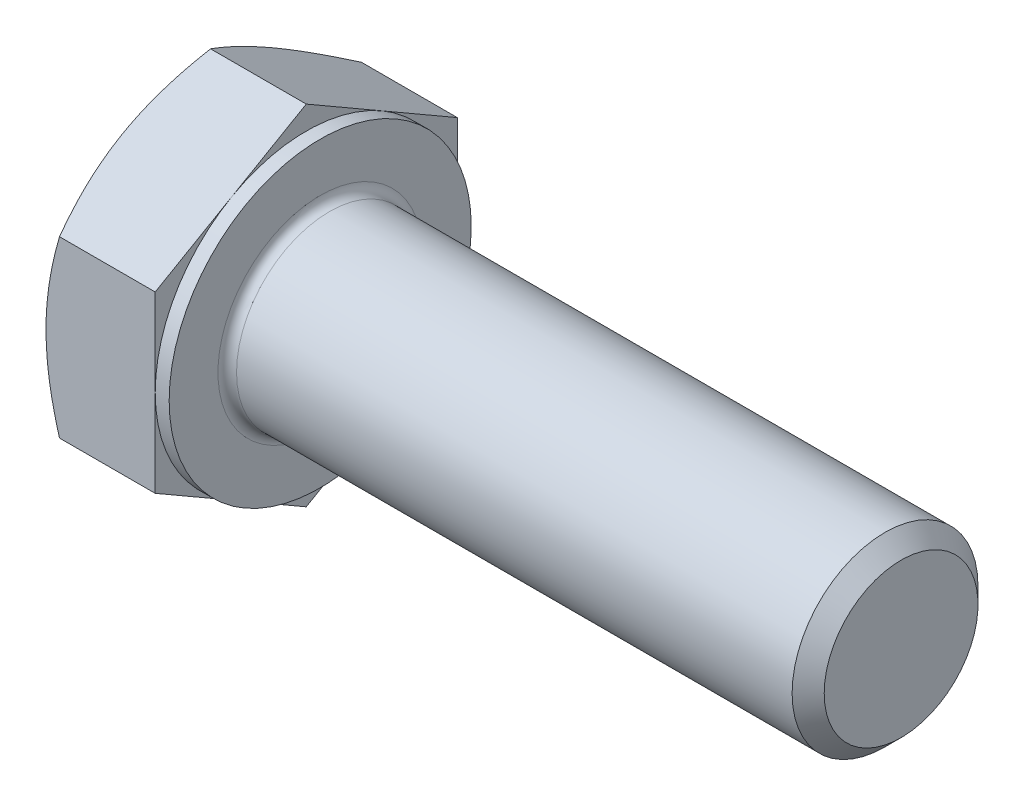
ISO-10303-21;
HEADER;
FILE_DESCRIPTION(('STEP AP214'),'2;1');
FILE_NAME('part.step','',(''),(''),'','','');
FILE_SCHEMA(('AUTOMOTIVE_DESIGN { 1 0 10303 214 1 1 1 1 }'));
ENDSEC;
DATA;
#1=APPLICATION_CONTEXT('core data for automotive mechanical design processes');
#2=APPLICATION_PROTOCOL_DEFINITION('international standard','automotive_design',2000,#1);
#3=PRODUCT_CONTEXT('',#1,'mechanical');
#4=PRODUCT('Part','Part','',(#3));
#5=PRODUCT_RELATED_PRODUCT_CATEGORY('part','',(#4));
#6=PRODUCT_DEFINITION_FORMATION('','',#4);
#7=PRODUCT_DEFINITION_CONTEXT('part definition',#1,'design');
#8=PRODUCT_DEFINITION('design','',#6,#7);
#9=PRODUCT_DEFINITION_SHAPE('','',#8);
#10=(LENGTH_UNIT() NAMED_UNIT(*) SI_UNIT(.MILLI.,.METRE.));
#11=(NAMED_UNIT(*) PLANE_ANGLE_UNIT() SI_UNIT($,.RADIAN.));
#12=(NAMED_UNIT(*) SI_UNIT($,.STERADIAN.) SOLID_ANGLE_UNIT());
#13=UNCERTAINTY_MEASURE_WITH_UNIT(LENGTH_MEASURE(1.E-05),#10,'distance_accuracy_value','');
#14=(GEOMETRIC_REPRESENTATION_CONTEXT(3) GLOBAL_UNCERTAINTY_ASSIGNED_CONTEXT((#13)) GLOBAL_UNIT_ASSIGNED_CONTEXT((#10,
#11,#12)) REPRESENTATION_CONTEXT('',''));
#15=CARTESIAN_POINT('',(0.,0.,0.));
#16=DIRECTION('',(0.,0.,1.));
#17=DIRECTION('',(1.,0.,0.));
#18=AXIS2_PLACEMENT_3D('',#15,#16,#17);
#19=CARTESIAN_POINT('',(5.3,7.50555349946514,0.));
#20=DIRECTION('',(1.,0.,0.));
#21=DIRECTION('',(0.,0.,-1.));
#22=AXIS2_PLACEMENT_3D('',#19,#20,#21);
#23=PLANE('',#22);
#24=CARTESIAN_POINT('',(5.3,0.,0.));
#25=DIRECTION('',(1.,0.,0.));
#26=DIRECTION('',(0.,0.,-1.));
#27=AXIS2_PLACEMENT_3D('',#24,#25,#26);
#28=CIRCLE('',#27,4.4);
#29=CARTESIAN_POINT('',(5.3,0.,-4.4));
#30=VERTEX_POINT('',#29);
#31=EDGE_CURVE('E44',#30,#30,#28,.F.);
#32=ORIENTED_EDGE('',*,*,#31,.T.);
#33=EDGE_LOOP('',(#32));
#34=FACE_BOUND('',#33,.T.);
#35=CARTESIAN_POINT('',(5.3,0.,0.));
#36=DIRECTION('',(1.,0.,0.));
#37=DIRECTION('',(0.,0.,-1.));
#38=AXIS2_PLACEMENT_3D('',#35,#36,#37);
#39=CIRCLE('',#38,6.5);
#40=CARTESIAN_POINT('',(5.3,0.,-6.5));
#41=VERTEX_POINT('',#40);
#42=EDGE_CURVE('E302',#41,#41,#39,.T.);
#43=ORIENTED_EDGE('',*,*,#42,.T.);
#44=EDGE_LOOP('',(#43));
#45=FACE_BOUND('',#44,.T.);
#46=ADVANCED_FACE('F36',(#34,#45),#23,.T.);
#47=CARTESIAN_POINT('',(0.,0.,0.));
#48=DIRECTION('',(-1.,0.,0.));
#49=DIRECTION('',(0.,0.,1.));
#50=AXIS2_PLACEMENT_3D('',#47,#48,#49);
#51=CYLINDRICAL_SURFACE('',#50,4.);
#52=CARTESIAN_POINT('',(5.7,0.,0.));
#53=DIRECTION('',(1.,0.,0.));
#54=DIRECTION('',(0.,0.,-1.));
#55=AXIS2_PLACEMENT_3D('',#52,#53,#54);
#56=CIRCLE('',#55,4.);
#57=CARTESIAN_POINT('',(5.7,0.,-4.));
#58=VERTEX_POINT('',#57);
#59=EDGE_CURVE('E11',#58,#58,#56,.T.);
#60=ORIENTED_EDGE('',*,*,#59,.T.);
#61=EDGE_LOOP('',(#60));
#62=FACE_BOUND('',#61,.T.);
#63=CARTESIAN_POINT('',(29.6095,0.,0.));
#64=DIRECTION('',(-1.,0.,0.));
#65=DIRECTION('',(0.,0.,1.));
#66=AXIS2_PLACEMENT_3D('',#63,#64,#65);
#67=CIRCLE('',#66,4.);
#68=CARTESIAN_POINT('',(29.6095,0.,4.));
#69=VERTEX_POINT('',#68);
#70=EDGE_CURVE('E281',#69,#69,#67,.T.);
#71=ORIENTED_EDGE('',*,*,#70,.T.);
#72=EDGE_LOOP('',(#71));
#73=FACE_BOUND('',#72,.T.);
#74=ADVANCED_FACE('F254',(#62,#73),#51,.T.);
#75=CARTESIAN_POINT('',(30.3,0.,0.));
#76=DIRECTION('',(-1.,0.,0.));
#77=DIRECTION('',(0.,0.,1.));
#78=AXIS2_PLACEMENT_3D('',#75,#76,#77);
#79=CONICAL_SURFACE('',#78,3.3095,0.785398163397441);
#80=ORIENTED_EDGE('',*,*,#70,.F.);
#81=EDGE_LOOP('',(#80));
#82=FACE_BOUND('',#81,.T.);
#83=CARTESIAN_POINT('',(30.3,0.,0.));
#84=DIRECTION('',(-1.,0.,0.));
#85=DIRECTION('',(0.,0.,1.));
#86=AXIS2_PLACEMENT_3D('',#83,#84,#85);
#87=CIRCLE('',#86,3.3095);
#88=CARTESIAN_POINT('',(30.3,0.,3.3095));
#89=VERTEX_POINT('',#88);
#90=EDGE_CURVE('E279',#89,#89,#87,.T.);
#91=ORIENTED_EDGE('',*,*,#90,.T.);
#92=EDGE_LOOP('',(#91));
#93=FACE_BOUND('',#92,.T.);
#94=ADVANCED_FACE('F260',(#82,#93),#79,.T.);
#95=CARTESIAN_POINT('',(30.3,0.,0.));
#96=DIRECTION('',(-1.,0.,0.));
#97=DIRECTION('',(0.,0.,1.));
#98=AXIS2_PLACEMENT_3D('',#95,#96,#97);
#99=PLANE('',#98);
#100=ORIENTED_EDGE('',*,*,#90,.F.);
#101=EDGE_LOOP('',(#100));
#102=FACE_BOUND('',#101,.T.);
#103=ADVANCED_FACE('F267',(#102),#99,.F.);
#104=CARTESIAN_POINT('',(4.7,6.5,0.));
#105=DIRECTION('',(1.,0.,0.));
#106=DIRECTION('',(0.,0.,-1.));
#107=AXIS2_PLACEMENT_3D('',#104,#105,#106);
#108=PLANE('',#107);
#109=DIRECTION('',(0.,0.500000000000001,0.866025403784438));
#110=VECTOR('',#109,1.);
#111=CARTESIAN_POINT('',(4.7,3.75277674973256,-6.5));
#112=LINE('',#111,#110);
#113=CARTESIAN_POINT('',(4.7,3.75277674973256,-6.5));
#114=VERTEX_POINT('',#113);
#115=CARTESIAN_POINT('',(4.7,5.62916512459885,-3.25000000000001));
#116=VERTEX_POINT('',#115);
#117=EDGE_CURVE('E168',#114,#116,#112,.T.);
#118=ORIENTED_EDGE('',*,*,#117,.T.);
#119=CARTESIAN_POINT('',(4.7,0.,0.));
#120=DIRECTION('',(-1.,0.,0.));
#121=DIRECTION('',(0.,0.,1.));
#122=AXIS2_PLACEMENT_3D('',#119,#120,#121);
#123=CIRCLE('',#122,6.5);
#124=CARTESIAN_POINT('',(4.7,0.,-6.5));
#125=VERTEX_POINT('',#124);
#126=EDGE_CURVE('E51',#116,#125,#123,.T.);
#127=ORIENTED_EDGE('',*,*,#126,.T.);
#128=DIRECTION('',(0.,1.,0.));
#129=VECTOR('',#128,1.);
#130=CARTESIAN_POINT('',(4.7,3.75277674973256,-6.5));
#131=LINE('',#130,#129);
#132=EDGE_CURVE('E305',#125,#114,#131,.T.);
#133=ORIENTED_EDGE('',*,*,#132,.T.);
#134=EDGE_LOOP('',(#118,#127,#133));
#135=FACE_BOUND('',#134,.T.);
#136=ADVANCED_FACE('F270',(#135),#108,.T.);
#137=CARTESIAN_POINT('',(4.7,7.50555349946514,0.));
#138=VERTEX_POINT('',#137);
#139=EDGE_CURVE('E166',#116,#138,#112,.T.);
#140=ORIENTED_EDGE('',*,*,#139,.T.);
#141=DIRECTION('',(0.,-0.500000000000001,0.866025403784438));
#142=VECTOR('',#141,1.);
#143=CARTESIAN_POINT('',(4.7,7.50555349946514,0.));
#144=LINE('',#143,#142);
#145=CARTESIAN_POINT('',(4.7,5.62916512459885,3.25000000000001));
#146=VERTEX_POINT('',#145);
#147=EDGE_CURVE('E165',#138,#146,#144,.T.);
#148=ORIENTED_EDGE('',*,*,#147,.T.);
#149=EDGE_CURVE('E154',#146,#116,#123,.T.);
#150=ORIENTED_EDGE('',*,*,#149,.T.);
#151=EDGE_LOOP('',(#140,#148,#150));
#152=FACE_BOUND('',#151,.T.);
#153=ADVANCED_FACE('F275',(#152),#108,.T.);
#154=CARTESIAN_POINT('',(4.7,3.75277674973256,6.5));
#155=VERTEX_POINT('',#154);
#156=EDGE_CURVE('E133',#146,#155,#144,.T.);
#157=ORIENTED_EDGE('',*,*,#156,.T.);
#158=DIRECTION('',(0.,-1.,0.));
#159=VECTOR('',#158,1.);
#160=CARTESIAN_POINT('',(4.7,3.75277674973256,6.5));
#161=LINE('',#160,#159);
#162=CARTESIAN_POINT('',(4.7,0.,6.5));
#163=VERTEX_POINT('',#162);
#164=EDGE_CURVE('E127',#155,#163,#161,.T.);
#165=ORIENTED_EDGE('',*,*,#164,.T.);
#166=EDGE_CURVE('E131',#163,#146,#123,.T.);
#167=ORIENTED_EDGE('',*,*,#166,.T.);
#168=EDGE_LOOP('',(#157,#165,#167));
#169=FACE_BOUND('',#168,.T.);
#170=ADVANCED_FACE('F129',(#169),#108,.T.);
#171=CARTESIAN_POINT('',(4.7,-3.75277674973256,6.5));
#172=VERTEX_POINT('',#171);
#173=EDGE_CURVE('E137',#163,#172,#161,.T.);
#174=ORIENTED_EDGE('',*,*,#173,.T.);
#175=DIRECTION('',(0.,-0.500000000000002,-0.866025403784437));
#176=VECTOR('',#175,1.);
#177=CARTESIAN_POINT('',(4.7,-7.50555349946515,0.));
#178=LINE('',#177,#176);
#179=CARTESIAN_POINT('',(4.7,-5.62916512459884,3.25000000000001));
#180=VERTEX_POINT('',#179);
#181=EDGE_CURVE('E144',#172,#180,#178,.T.);
#182=ORIENTED_EDGE('',*,*,#181,.T.);
#183=EDGE_CURVE('E141',#180,#163,#123,.T.);
#184=ORIENTED_EDGE('',*,*,#183,.T.);
#185=EDGE_LOOP('',(#174,#182,#184));
#186=FACE_BOUND('',#185,.T.);
#187=ADVANCED_FACE('F142',(#186),#108,.T.);
#188=CARTESIAN_POINT('',(4.7,-7.50555349946515,0.));
#189=VERTEX_POINT('',#188);
#190=EDGE_CURVE('E160',#180,#189,#178,.T.);
#191=ORIENTED_EDGE('',*,*,#190,.T.);
#192=DIRECTION('',(0.,0.500000000000001,-0.866025403784438));
#193=VECTOR('',#192,1.);
#194=CARTESIAN_POINT('',(4.7,-3.75277674973258,-6.5));
#195=LINE('',#194,#193);
#196=CARTESIAN_POINT('',(4.7,-5.62916512459885,-3.25000000000001));
#197=VERTEX_POINT('',#196);
#198=EDGE_CURVE('E343',#189,#197,#195,.T.);
#199=ORIENTED_EDGE('',*,*,#198,.T.);
#200=EDGE_CURVE('E148',#197,#180,#123,.T.);
#201=ORIENTED_EDGE('',*,*,#200,.T.);
#202=EDGE_LOOP('',(#191,#199,#201));
#203=FACE_BOUND('',#202,.T.);
#204=ADVANCED_FACE('F344',(#203),#108,.T.);
#205=CARTESIAN_POINT('',(4.7,-3.75277674973258,-6.5));
#206=VERTEX_POINT('',#205);
#207=EDGE_CURVE('E155',#197,#206,#195,.T.);
#208=ORIENTED_EDGE('',*,*,#207,.T.);
#209=EDGE_CURVE('E306',#206,#125,#131,.T.);
#210=ORIENTED_EDGE('',*,*,#209,.T.);
#211=EDGE_CURVE('E313',#125,#197,#123,.T.);
#212=ORIENTED_EDGE('',*,*,#211,.T.);
#213=EDGE_LOOP('',(#208,#210,#212));
#214=FACE_BOUND('',#213,.T.);
#215=ADVANCED_FACE('F276',(#214),#108,.T.);
#216=CARTESIAN_POINT('',(0.,0.,0.));
#217=DIRECTION('',(-1.,0.,0.));
#218=DIRECTION('',(0.,0.,1.));
#219=AXIS2_PLACEMENT_3D('',#216,#217,#218);
#220=CYLINDRICAL_SURFACE('',#219,6.5);
#221=ORIENTED_EDGE('',*,*,#126,.F.);
#222=ORIENTED_EDGE('',*,*,#149,.F.);
#223=ORIENTED_EDGE('',*,*,#166,.F.);
#224=ORIENTED_EDGE('',*,*,#183,.F.);
#225=ORIENTED_EDGE('',*,*,#200,.F.);
#226=ORIENTED_EDGE('',*,*,#211,.F.);
#227=EDGE_LOOP('',(#221,#222,#223,#224,#225,#226));
#228=FACE_BOUND('',#227,.T.);
#229=ORIENTED_EDGE('',*,*,#42,.F.);
#230=EDGE_LOOP('',(#229));
#231=FACE_BOUND('',#230,.T.);
#232=ADVANCED_FACE('F151',(#228,#231),#220,.T.);
#233=CARTESIAN_POINT('',(0.,7.50555349946514,0.));
#234=DIRECTION('',(1.,0.,0.));
#235=DIRECTION('',(0.,0.,-1.));
#236=AXIS2_PLACEMENT_3D('',#233,#234,#235);
#237=PLANE('',#236);
#238=CARTESIAN_POINT('',(0.,0.,0.));
#239=DIRECTION('',(1.,0.,0.));
#240=DIRECTION('',(0.,0.,-1.));
#241=AXIS2_PLACEMENT_3D('',#238,#239,#240);
#242=CIRCLE('',#241,6.5);
#243=CARTESIAN_POINT('',(0.,0.,-6.5));
#244=VERTEX_POINT('',#243);
#245=CARTESIAN_POINT('',(0.,5.62916512459885,-3.25000000000001));
#246=VERTEX_POINT('',#245);
#247=EDGE_CURVE('E301',#244,#246,#242,.T.);
#248=ORIENTED_EDGE('',*,*,#247,.F.);
#249=CARTESIAN_POINT('',(0.,-5.62916512459885,-3.25));
#250=VERTEX_POINT('',#249);
#251=EDGE_CURVE('E297',#250,#244,#242,.T.);
#252=ORIENTED_EDGE('',*,*,#251,.F.);
#253=CARTESIAN_POINT('',(0.,-5.62916512459884,3.25000000000001));
#254=VERTEX_POINT('',#253);
#255=EDGE_CURVE('E300',#254,#250,#242,.T.);
#256=ORIENTED_EDGE('',*,*,#255,.F.);
#257=CARTESIAN_POINT('',(0.,0.,6.5));
#258=VERTEX_POINT('',#257);
#259=EDGE_CURVE('E336',#258,#254,#242,.T.);
#260=ORIENTED_EDGE('',*,*,#259,.F.);
#261=CARTESIAN_POINT('',(0.,0.,0.));
#262=DIRECTION('',(-1.,0.,0.));
#263=DIRECTION('',(0.,0.,1.));
#264=AXIS2_PLACEMENT_3D('',#261,#262,#263);
#265=CIRCLE('',#264,6.5);
#266=CARTESIAN_POINT('',(0.,5.62916512459885,3.25000000000001));
#267=VERTEX_POINT('',#266);
#268=EDGE_CURVE('E169',#258,#267,#265,.T.);
#269=ORIENTED_EDGE('',*,*,#268,.T.);
#270=EDGE_CURVE('E359',#246,#267,#242,.T.);
#271=ORIENTED_EDGE('',*,*,#270,.F.);
#272=EDGE_LOOP('',(#248,#252,#256,#260,#269,#271));
#273=FACE_BOUND('',#272,.T.);
#274=ADVANCED_FACE('F200',(#273),#237,.F.);
#275=CARTESIAN_POINT('',(0.,0.,0.));
#276=DIRECTION('',(1.,0.,0.));
#277=DIRECTION('',(0.,0.,-1.));
#278=AXIS2_PLACEMENT_3D('',#275,#276,#277);
#279=CONICAL_SURFACE('',#278,6.5,1.0471975511966);
#280=CARTESIAN_POINT('',(0.580623251805866,3.75266127967873,6.5002));
#281=CARTESIAN_POINT('',(0.533004423075484,3.8351516191275,6.35732254094112));
#282=CARTESIAN_POINT('',(0.487546700602705,3.91794952254312,6.21391236546509));
#283=CARTESIAN_POINT('',(0.401548682023045,4.08421773795794,5.92592736868281));
#284=CARTESIAN_POINT('',(0.361010507228024,4.16768832359105,5.78135207342874));
#285=CARTESIAN_POINT('',(0.247571001123208,4.41943655294051,5.34531134947997));
#286=CARTESIAN_POINT('',(0.183047807128738,4.58870793403689,5.05212471715368));
#287=CARTESIAN_POINT('',(0.107386583547491,4.84201947708215,4.61337625445563));
#288=CARTESIAN_POINT('',(0.0858328564569873,4.92530276780316,4.46912536350531));
#289=CARTESIAN_POINT('',(0.049690314606119,5.09224566542477,4.17997178286191));
#290=CARTESIAN_POINT('',(0.0351008844596665,5.17590523841627,4.03506915190111));
#291=CARTESIAN_POINT('',(0.0132587525073469,5.34336968579964,3.74501222057168));
#292=CARTESIAN_POINT('',(0.00599772432210823,5.427174286676,3.59985839394579));
#293=CARTESIAN_POINT('',(-0.00103969741776798,5.59485627940483,3.30942466302505));
#294=CARTESIAN_POINT('',(-0.00081632218779477,5.6787336689286,3.16414476276365));
#295=CARTESIAN_POINT('',(0.0100834585151658,5.90853103021317,2.76612405757351));
#296=CARTESIAN_POINT('',(0.028381817869414,6.05437578112763,2.51351353897243));
#297=CARTESIAN_POINT('',(0.0864063414576757,6.34509659313135,2.00997032176432));
#298=CARTESIAN_POINT('',(0.126152338538245,6.48997163178545,1.75903939406692));
#299=CARTESIAN_POINT('',(0.22550590320215,6.78127752911039,1.25448277935568));
#300=CARTESIAN_POINT('',(0.285534425638028,6.92767163007068,1.00092075856409));
#301=CARTESIAN_POINT('',(0.42177499250987,7.21827667013277,0.497578064240955));
#302=CARTESIAN_POINT('',(0.497955034163595,7.36249133098589,0.247790944447036));
#303=CARTESIAN_POINT('',(0.580623251805869,7.50566896951898,-0.000200000000000043));
#304=B_SPLINE_CURVE_WITH_KNOTS('',3,(#280,#281,#282,#283,#284,#285,#286,#287,#288,#289,#290,
#291,#292,#293,#294,#295,#296,#297,#298,#299,#300,#301,#302,#303),.UNSPECIFIED.,.F.,.F.,(4,2,2,
2,2,2,2,2,2,2,2,4),(0.,0.515105052395588,1.03043143507524,2.06322554824262,2.56697389547996,
3.07067772176453,3.57380860368927,4.0769239424252,4.9527935470566,5.82947446853466,
6.72559912449737,7.61996451221046),.UNSPECIFIED.);
#305=CARTESIAN_POINT('',(0.580556583600765,7.50555349946514,0.));
#306=VERTEX_POINT('',#305);
#307=EDGE_CURVE('E220',#267,#306,#304,.T.);
#308=ORIENTED_EDGE('',*,*,#307,.T.);
#309=CARTESIAN_POINT('',(0.580623251805869,7.50566896951898,0.000200000000000058));
#310=CARTESIAN_POINT('',(0.533004423075487,7.4231786300702,-0.14267745905888));
#311=CARTESIAN_POINT('',(0.487546700602708,7.34038072665458,-0.286087634534913));
#312=CARTESIAN_POINT('',(0.401548682023048,7.17411251123976,-0.574072631317195));
#313=CARTESIAN_POINT('',(0.361010507228027,7.09064192560665,-0.718647926571264));
#314=CARTESIAN_POINT('',(0.24757100112321,6.83889369625719,-1.15468865052003));
#315=CARTESIAN_POINT('',(0.18304780712874,6.66962231516081,-1.44787528284632));
#316=CARTESIAN_POINT('',(0.107386583547492,6.41631077211555,-1.88662374554437));
#317=CARTESIAN_POINT('',(0.0858328564569873,6.33302748139454,-2.03087463649469));
#318=CARTESIAN_POINT('',(0.0496903146061189,6.16608458377293,-2.32002821713809));
#319=CARTESIAN_POINT('',(0.0351008844596667,6.08242501078143,-2.46493084809889));
#320=CARTESIAN_POINT('',(0.0132587525073468,5.91496056339806,-2.75498777942832));
#321=CARTESIAN_POINT('',(0.00599772432210739,5.8311559625217,-2.90014160605421));
#322=CARTESIAN_POINT('',(-0.00103969741776939,5.66347396979287,-3.19057533697495));
#323=CARTESIAN_POINT('',(-0.000816322187796096,5.5795965802691,-3.33585523723636));
#324=CARTESIAN_POINT('',(0.0100834585151643,5.34979921898453,-3.73387594242649));
#325=CARTESIAN_POINT('',(0.028381817869412,5.20395446807007,-3.98648646102757));
#326=CARTESIAN_POINT('',(0.0864063414576732,4.91323365606635,-4.49002967823568));
#327=CARTESIAN_POINT('',(0.126152338538243,4.76835861741225,-4.74096060593308));
#328=CARTESIAN_POINT('',(0.225505903202147,4.47705272008731,-5.24551722064432));
#329=CARTESIAN_POINT('',(0.285534425638024,4.33065861912702,-5.49907924143591));
#330=CARTESIAN_POINT('',(0.421774992509865,4.04005357906493,-6.00242193575904));
#331=CARTESIAN_POINT('',(0.497955034163589,3.89583891821181,-6.25220905555296));
#332=CARTESIAN_POINT('',(0.580623251805864,3.75266127967872,-6.5002));
#333=B_SPLINE_CURVE_WITH_KNOTS('',3,(#309,#310,#311,#312,#313,#314,#315,#316,#317,#318,#319,
#320,#321,#322,#323,#324,#325,#326,#327,#328,#329,#330,#331,#332),.UNSPECIFIED.,.F.,.F.,(4,2,2,
2,2,2,2,2,2,2,2,4),(0.,0.515105052395587,1.03043143507525,2.06322554824262,2.56697389547996,
3.07067772176454,3.57380860368928,4.0769239424252,4.9527935470566,5.82947446853466,
6.72559912449737,7.61996451221046),.UNSPECIFIED.);
#334=EDGE_CURVE('E59',#306,#246,#333,.T.);
#335=ORIENTED_EDGE('',*,*,#334,.T.);
#336=ORIENTED_EDGE('',*,*,#270,.T.);
#337=EDGE_LOOP('',(#308,#335,#336));
#338=FACE_BOUND('',#337,.T.);
#339=ADVANCED_FACE('F360',(#338),#279,.T.);
#340=CARTESIAN_POINT('',(3.18835311563218,-10.1137456673369,6.5));
#341=CARTESIAN_POINT('',(3.05034773984571,-9.82952666268362,6.5));
#342=CARTESIAN_POINT('',(2.91365616465171,-9.5446586959737,6.5));
#343=CARTESIAN_POINT('',(2.64363899475029,-8.97327978009769,6.5));
#344=CARTESIAN_POINT('',(2.51031392437708,-8.68676858342198,6.5));
#345=CARTESIAN_POINT('',(2.2471047346358,-8.11029837800201,6.5));
#346=CARTESIAN_POINT('',(2.11724300420667,-7.82032911160931,6.5));
#347=CARTESIAN_POINT('',(1.86279082811121,-7.23809540985588,6.5));
#348=CARTESIAN_POINT('',(1.73820013539998,-6.94583108282377,6.5));
#349=CARTESIAN_POINT('',(1.49176685414526,-6.3490644093219,6.5));
#350=CARTESIAN_POINT('',(1.37014257629962,-6.04447142260091,6.5));
#351=CARTESIAN_POINT('',(1.13601865749049,-5.43173420932696,6.5));
#352=CARTESIAN_POINT('',(1.02352003549992,-5.12358959057325,6.5));
#353=CARTESIAN_POINT('',(0.810575368180001,-4.50382569763974,6.5));
#354=CARTESIAN_POINT('',(0.710105232251764,-4.19221478250844,6.5));
#355=CARTESIAN_POINT('',(0.524420166111966,-3.56452019194196,6.5));
#356=CARTESIAN_POINT('',(0.439200468182008,-3.248437947833,6.5));
#357=CARTESIAN_POINT('',(0.288524223393068,-2.61335465708693,6.5));
#358=CARTESIAN_POINT('',(0.222961865744181,-2.29437912058766,6.5));
#359=CARTESIAN_POINT('',(0.115312883140193,-1.65238219411907,6.5));
#360=CARTESIAN_POINT('',(0.0732239014810091,-1.32936121363906,6.5));
#361=CARTESIAN_POINT('',(0.0304887136492794,-0.845231171985975,6.5));
#362=CARTESIAN_POINT('',(0.0196493434374821,-0.684982209825922,6.5));
#363=CARTESIAN_POINT('',(0.00475298486802876,-0.364162349261904,6.5));
#364=CARTESIAN_POINT('',(0.000695882912927172,-0.203591456295117,6.5));
#365=CARTESIAN_POINT('',(-0.000531597192431328,0.1175774301276,6.5));
#366=CARTESIAN_POINT('',(0.00229809016385267,0.278175423826781,6.5));
#367=CARTESIAN_POINT('',(0.0147726845392773,0.599108972527034,6.5));
#368=CARTESIAN_POINT('',(0.0244179260292906,0.759444514261301,6.5));
#369=CARTESIAN_POINT('',(0.0554961939005615,1.14369946568681,6.5));
#370=CARTESIAN_POINT('',(0.0801030490102269,1.36736763010324,6.5));
#371=CARTESIAN_POINT('',(0.141246537396777,1.81305591275147,6.5));
#372=CARTESIAN_POINT('',(0.177784759549961,2.03507580745699,6.5));
#373=CARTESIAN_POINT('',(0.303360001243785,2.69839633393827,6.5));
#374=CARTESIAN_POINT('',(0.408335815043155,3.13672010332747,6.5));
#375=CARTESIAN_POINT('',(0.590564593006713,3.79232112874052,6.5));
#376=CARTESIAN_POINT('',(0.65631319884288,4.01299150829171,6.5));
#377=CARTESIAN_POINT('',(0.794681634048787,4.45218858961827,6.5));
#378=CARTESIAN_POINT('',(0.867301512962924,4.67071527592428,6.5));
#379=CARTESIAN_POINT('',(1.01824353836803,5.10569490203688,6.5));
#380=CARTESIAN_POINT('',(1.09656388214599,5.32214847315217,6.5));
#381=CARTESIAN_POINT('',(1.25798086145111,5.75325725721539,6.5));
#382=CARTESIAN_POINT('',(1.34107741015562,5.96791250277235,6.5));
#383=CARTESIAN_POINT('',(1.56029019561415,6.51888445883542,6.5));
#384=CARTESIAN_POINT('',(1.69936356644503,6.85402316761088,6.5));
#385=CARTESIAN_POINT('',(1.98501958064622,7.52109583887401,6.5));
#386=CARTESIAN_POINT('',(2.13160288757765,7.85302951508196,6.5));
#387=CARTESIAN_POINT('',(2.43059748021416,8.51437865467404,6.5));
#388=CARTESIAN_POINT('',(2.5830105757321,8.84379329733069,6.5));
#389=CARTESIAN_POINT('',(2.89234869350808,9.50047798633191,6.5));
#390=CARTESIAN_POINT('',(3.04927357195785,9.82774810062368,6.5));
#391=CARTESIAN_POINT('',(3.36692013106101,10.4809971970749,6.5));
#392=CARTESIAN_POINT('',(3.52764676467091,10.8069737662429,6.5));
#393=CARTESIAN_POINT('',(3.85198555530079,11.4574882896092,6.5));
#394=CARTESIAN_POINT('',(4.01559773098172,11.7820262344869,6.5));
#395=CARTESIAN_POINT('',(4.50986184978697,12.753746810957,6.5));
#396=CARTESIAN_POINT('',(4.84399997953393,13.399155592763,6.5));
#397=CARTESIAN_POINT('',(5.48575990240557,14.6239779286089,6.5));
#398=CARTESIAN_POINT('',(5.79279643346765,15.20369957558,6.5));
#399=CARTESIAN_POINT('',(6.41069188201846,16.361138263307,6.5));
#400=CARTESIAN_POINT('',(6.72155098984205,16.9388552023925,6.5));
#401=CARTESIAN_POINT('',(7.34519775412869,18.0910273551188,6.5));
#402=CARTESIAN_POINT('',(7.65797694142596,18.6654871601313,6.5));
#403=CARTESIAN_POINT('',(8.28574397126581,19.8131486199609,6.5));
#404=CARTESIAN_POINT('',(8.60073166267673,20.386350357412,6.5));
#405=CARTESIAN_POINT('',(8.91652967142033,20.9591024516605,6.5));
#406=B_SPLINE_CURVE_WITH_KNOTS('',3,(#340,#341,#342,#343,#344,#345,#346,#347,#348,#349,#350,
#351,#352,#353,#354,#355,#356,#357,#358,#359,#360,#361,#362,#363,#364,#365,#366,#367,#368,#369,
#370,#371,#372,#373,#374,#375,#376,#377,#378,#379,#380,#381,#382,#383,#384,#385,#386,#387,#388,
#389,#390,#391,#392,#393,#394,#395,#396,#397,#398,#399,#400,#401,#402,#403,#404,#405),
.UNSPECIFIED.,.F.,.F.,(4,2,2,2,2,2,2,2,2,2,2,2,2,2,2,2,2,2,2,2,2,2,2,2,2,2,2,2,2,2,2,2,4),(0.,
0.947868666637001,1.89588406470429,2.84900320910869,3.80207763278045,4.78589774049431,
5.7698275510146,6.75175256199404,7.7333700571013,8.70960474826445,9.68574140876309,
10.1674651045585,10.6491807317952,11.1309009410869,11.612644792267,12.2873175714037,
12.9620802320305,14.3123184370259,15.0030310333297,15.6937486103038,16.3842486961975,
17.074736234034,18.1631508671877,19.2516618366358,20.3405135130782,21.4293305219253,
22.5196540535909,23.6099846390268,25.7902468223404,27.7582608860787,29.7263733417655,
31.6886408583916,33.6507753794603),.UNSPECIFIED.);
#407=CARTESIAN_POINT('',(0.580556583600762,3.75277674973256,6.5));
#408=VERTEX_POINT('',#407);
#409=EDGE_CURVE('E234',#258,#408,#406,.T.);
#410=ORIENTED_EDGE('',*,*,#409,.T.);
#411=EDGE_CURVE('E233',#408,#267,#304,.T.);
#412=ORIENTED_EDGE('',*,*,#411,.T.);
#413=ORIENTED_EDGE('',*,*,#268,.F.);
#414=EDGE_LOOP('',(#410,#412,#413));
#415=FACE_BOUND('',#414,.T.);
#416=ADVANCED_FACE('F330',(#415),#279,.T.);
#417=CARTESIAN_POINT('',(0.580556583600761,-3.75277674973256,6.5));
#418=VERTEX_POINT('',#417);
#419=EDGE_CURVE('E282',#418,#258,#406,.T.);
#420=ORIENTED_EDGE('',*,*,#419,.T.);
#421=ORIENTED_EDGE('',*,*,#259,.T.);
#422=CARTESIAN_POINT('',(0.580623251805876,-7.50566896951899,-0.000200000000000038));
#423=CARTESIAN_POINT('',(0.533004423075494,-7.42317863007021,0.142677459058881));
#424=CARTESIAN_POINT('',(0.487546700602714,-7.34038072665459,0.286087634534913));
#425=CARTESIAN_POINT('',(0.401548682023053,-7.17411251123977,0.574072631317195));
#426=CARTESIAN_POINT('',(0.361010507228032,-7.09064192560666,0.718647926571264));
#427=CARTESIAN_POINT('',(0.247571001123215,-6.8388936962572,1.15468865052003));
#428=CARTESIAN_POINT('',(0.183047807128745,-6.66962231516082,1.44787528284632));
#429=CARTESIAN_POINT('',(0.107386583547496,-6.41631077211556,1.88662374554438));
#430=CARTESIAN_POINT('',(0.0858328564569921,-6.33302748139455,2.03087463649469));
#431=CARTESIAN_POINT('',(0.0496903146061233,-6.16608458377294,2.32002821713809));
#432=CARTESIAN_POINT('',(0.0351008844596709,-6.08242501078144,2.46493084809889));
#433=CARTESIAN_POINT('',(0.0132587525073508,-5.91496056339807,2.75498777942832));
#434=CARTESIAN_POINT('',(0.00599772432211139,-5.83115596252171,2.90014160605421));
#435=CARTESIAN_POINT('',(-0.00103969741776562,-5.66347396979287,3.19057533697495));
#436=CARTESIAN_POINT('',(-0.000816322187792552,-5.5795965802691,3.33585523723636));
#437=CARTESIAN_POINT('',(0.0100834585151674,-5.34979921898453,3.7338759424265));
#438=CARTESIAN_POINT('',(0.0283818178694149,-5.20395446807007,3.98648646102757));
#439=CARTESIAN_POINT('',(0.0864063414576758,-4.91323365606636,4.49002967823568));
#440=CARTESIAN_POINT('',(0.126152338538245,-4.76835861741226,4.74096060593308));
#441=CARTESIAN_POINT('',(0.225505903202149,-4.47705272008732,5.24551722064432));
#442=CARTESIAN_POINT('',(0.285534425638026,-4.33065861912702,5.49907924143591));
#443=CARTESIAN_POINT('',(0.421774992509868,-4.04005357906493,6.00242193575904));
#444=CARTESIAN_POINT('',(0.497955034163592,-3.89583891821181,6.25220905555296));
#445=CARTESIAN_POINT('',(0.580623251805865,-3.75266127967872,6.5002));
#446=B_SPLINE_CURVE_WITH_KNOTS('',3,(#422,#423,#424,#425,#426,#427,#428,#429,#430,#431,#432,
#433,#434,#435,#436,#437,#438,#439,#440,#441,#442,#443,#444,#445),.UNSPECIFIED.,.F.,.F.,(4,2,2,
2,2,2,2,2,2,2,2,4),(0.,0.515105052395589,1.03043143507525,2.06322554824263,2.56697389547997,
3.07067772176454,3.57380860368929,4.07692394242521,4.95279354705661,5.82947446853467,
6.72559912449737,7.61996451221047),.UNSPECIFIED.);
#447=EDGE_CURVE('E222',#254,#418,#446,.T.);
#448=ORIENTED_EDGE('',*,*,#447,.T.);
#449=EDGE_LOOP('',(#420,#421,#448));
#450=FACE_BOUND('',#449,.T.);
#451=ADVANCED_FACE('F189',(#450),#279,.T.);
#452=CARTESIAN_POINT('',(0.580556583600772,-7.50555349946515,0.));
#453=VERTEX_POINT('',#452);
#454=EDGE_CURVE('E214',#453,#254,#446,.T.);
#455=ORIENTED_EDGE('',*,*,#454,.T.);
#456=ORIENTED_EDGE('',*,*,#255,.T.);
#457=CARTESIAN_POINT('',(0.580623251805869,-3.75266127967874,-6.5002));
#458=CARTESIAN_POINT('',(0.533004423075487,-3.83515161912751,-6.35732254094112));
#459=CARTESIAN_POINT('',(0.487546700602708,-3.91794952254313,-6.21391236546509));
#460=CARTESIAN_POINT('',(0.401548682023048,-4.08421773795796,-5.9259273686828));
#461=CARTESIAN_POINT('',(0.361010507228027,-4.16768832359106,-5.78135207342873));
#462=CARTESIAN_POINT('',(0.247571001123211,-4.41943655294053,-5.34531134947996));
#463=CARTESIAN_POINT('',(0.183047807128742,-4.58870793403691,-5.05212471715368));
#464=CARTESIAN_POINT('',(0.107386583547495,-4.84201947708216,-4.61337625445562));
#465=CARTESIAN_POINT('',(0.0858328564569916,-4.92530276780317,-4.46912536350531));
#466=CARTESIAN_POINT('',(0.0496903146061235,-5.09224566542478,-4.17997178286191));
#467=CARTESIAN_POINT('',(0.0351008844596713,-5.17590523841629,-4.03506915190111));
#468=CARTESIAN_POINT('',(0.0132587525073522,-5.34336968579965,-3.74501222057168));
#469=CARTESIAN_POINT('',(0.00599772432211368,-5.42717428667601,-3.59985839394579));
#470=CARTESIAN_POINT('',(-0.00103969741776216,-5.59485627940485,-3.30942466302505));
#471=CARTESIAN_POINT('',(-0.000816322187788783,-5.67873366892861,-3.16414476276364));
#472=CARTESIAN_POINT('',(0.0100834585151722,-5.90853103021318,-2.7661240575735));
#473=CARTESIAN_POINT('',(0.0283818178694205,-6.05437578112765,-2.51351353897243));
#474=CARTESIAN_POINT('',(0.0864063414576828,-6.34509659313136,-2.00997032176432));
#475=CARTESIAN_POINT('',(0.126152338538253,-6.48997163178546,-1.75903939406692));
#476=CARTESIAN_POINT('',(0.225505903202158,-6.7812775291104,-1.25448277935568));
#477=CARTESIAN_POINT('',(0.285534425638035,-6.92767163007069,-1.00092075856409));
#478=CARTESIAN_POINT('',(0.421774992509877,-7.21827667013278,-0.497578064240955));
#479=CARTESIAN_POINT('',(0.497955034163601,-7.3624913309859,-0.247790944447036));
#480=CARTESIAN_POINT('',(0.580623251805876,-7.50566896951899,0.000199999999999512));
#481=B_SPLINE_CURVE_WITH_KNOTS('',3,(#457,#458,#459,#460,#461,#462,#463,#464,#465,#466,#467,
#468,#469,#470,#471,#472,#473,#474,#475,#476,#477,#478,#479,#480),.UNSPECIFIED.,.F.,.F.,(4,2,2,
2,2,2,2,2,2,2,2,4),(0.,0.515105052395588,1.03043143507525,2.06322554824262,2.56697389547997,
3.07067772176454,3.57380860368928,4.0769239424252,4.9527935470566,5.82947446853466,
6.72559912449736,7.61996451221046),.UNSPECIFIED.);
#482=EDGE_CURVE('E221',#250,#453,#481,.T.);
#483=ORIENTED_EDGE('',*,*,#482,.T.);
#484=EDGE_LOOP('',(#455,#456,#483));
#485=FACE_BOUND('',#484,.T.);
#486=ADVANCED_FACE('F358',(#485),#279,.T.);
#487=CARTESIAN_POINT('',(0.58055658360076,3.75277674973256,-6.5));
#488=VERTEX_POINT('',#487);
#489=EDGE_CURVE('E223',#246,#488,#333,.T.);
#490=ORIENTED_EDGE('',*,*,#489,.T.);
#491=CARTESIAN_POINT('',(3.18835311563219,-10.1137456673369,-6.5));
#492=CARTESIAN_POINT('',(3.05034773984572,-9.82952666268364,-6.5));
#493=CARTESIAN_POINT('',(2.91365616465172,-9.54465869597372,-6.5));
#494=CARTESIAN_POINT('',(2.64363899475029,-8.9732797800977,-6.5));
#495=CARTESIAN_POINT('',(2.51031392437709,-8.68676858342199,-6.5));
#496=CARTESIAN_POINT('',(2.24710473463581,-8.11029837800202,-6.5));
#497=CARTESIAN_POINT('',(2.11724300420667,-7.82032911160933,-6.5));
#498=CARTESIAN_POINT('',(1.86279082811121,-7.2380954098559,-6.5));
#499=CARTESIAN_POINT('',(1.73820013539999,-6.94583108282378,-6.5));
#500=CARTESIAN_POINT('',(1.49176685414526,-6.34906440932191,-6.5));
#501=CARTESIAN_POINT('',(1.37014257629962,-6.04447142260092,-6.5));
#502=CARTESIAN_POINT('',(1.13601865749049,-5.43173420932698,-6.5));
#503=CARTESIAN_POINT('',(1.02352003549993,-5.12358959057326,-6.5));
#504=CARTESIAN_POINT('',(0.810575368180005,-4.50382569763975,-6.5));
#505=CARTESIAN_POINT('',(0.710105232251767,-4.19221478250845,-6.5));
#506=CARTESIAN_POINT('',(0.524420166111968,-3.56452019194197,-6.5));
#507=CARTESIAN_POINT('',(0.439200468182011,-3.24843794783301,-6.5));
#508=CARTESIAN_POINT('',(0.288524223393071,-2.61335465708694,-6.5));
#509=CARTESIAN_POINT('',(0.222961865744182,-2.29437912058768,-6.5));
#510=CARTESIAN_POINT('',(0.115312883140194,-1.65238219411908,-6.5));
#511=CARTESIAN_POINT('',(0.0732239014810108,-1.32936121363908,-6.5));
#512=CARTESIAN_POINT('',(0.0304887136492798,-0.845231171985987,-6.5));
#513=CARTESIAN_POINT('',(0.0196493434374816,-0.684982209825934,-6.5));
#514=CARTESIAN_POINT('',(0.00475298486802777,-0.364162349261915,-6.5));
#515=CARTESIAN_POINT('',(0.000695882912926453,-0.203591456295128,-6.5));
#516=CARTESIAN_POINT('',(-0.000531597192432105,0.11757743012759,-6.5));
#517=CARTESIAN_POINT('',(0.00229809016385158,0.278175423826772,-6.5));
#518=CARTESIAN_POINT('',(0.0147726845392758,0.599108972527025,-6.5));
#519=CARTESIAN_POINT('',(0.024417926029289,0.759444514261292,-6.5));
#520=CARTESIAN_POINT('',(0.0554961939005595,1.1436994656868,-6.5));
#521=CARTESIAN_POINT('',(0.0801030490102248,1.36736763010323,-6.5));
#522=CARTESIAN_POINT('',(0.141246537396774,1.81305591275146,-6.5));
#523=CARTESIAN_POINT('',(0.177784759549958,2.03507580745698,-6.5));
#524=CARTESIAN_POINT('',(0.303360001243781,2.69839633393825,-6.5));
#525=CARTESIAN_POINT('',(0.40833581504315,3.13672010332745,-6.5));
#526=CARTESIAN_POINT('',(0.590564593006708,3.79232112874051,-6.5));
#527=CARTESIAN_POINT('',(0.656313198842875,4.0129915082917,-6.5));
#528=CARTESIAN_POINT('',(0.794681634048782,4.45218858961826,-6.5));
#529=CARTESIAN_POINT('',(0.867301512962918,4.67071527592427,-6.5));
#530=CARTESIAN_POINT('',(1.01824353836802,5.10569490203687,-6.5));
#531=CARTESIAN_POINT('',(1.09656388214598,5.32214847315216,-6.5));
#532=CARTESIAN_POINT('',(1.2579808614511,5.75325725721537,-6.5));
#533=CARTESIAN_POINT('',(1.34107741015562,5.96791250277233,-6.5));
#534=CARTESIAN_POINT('',(1.56029019561415,6.5188844588354,-6.5));
#535=CARTESIAN_POINT('',(1.69936356644502,6.85402316761086,-6.5));
#536=CARTESIAN_POINT('',(1.98501958064621,7.52109583887399,-6.5));
#537=CARTESIAN_POINT('',(2.13160288757764,7.85302951508194,-6.5));
#538=CARTESIAN_POINT('',(2.43059748021415,8.51437865467402,-6.5));
#539=CARTESIAN_POINT('',(2.58301057573209,8.84379329733066,-6.5));
#540=CARTESIAN_POINT('',(2.89234869350807,9.50047798633189,-6.5));
#541=CARTESIAN_POINT('',(3.04927357195784,9.82774810062366,-6.5));
#542=CARTESIAN_POINT('',(3.366920131061,10.4809971970749,-6.5));
#543=CARTESIAN_POINT('',(3.5276467646709,10.8069737662429,-6.5));
#544=CARTESIAN_POINT('',(3.85198555530078,11.4574882896092,-6.5));
#545=CARTESIAN_POINT('',(4.01559773098171,11.7820262344869,-6.5));
#546=CARTESIAN_POINT('',(4.50986184978696,12.7537468109569,-6.5));
#547=CARTESIAN_POINT('',(4.84399997953392,13.399155592763,-6.5));
#548=CARTESIAN_POINT('',(5.48575990240556,14.6239779286088,-6.5));
#549=CARTESIAN_POINT('',(5.79279643346764,15.20369957558,-6.5));
#550=CARTESIAN_POINT('',(6.41069188201845,16.361138263307,-6.5));
#551=CARTESIAN_POINT('',(6.72155098984204,16.9388552023925,-6.5));
#552=CARTESIAN_POINT('',(7.34519775412868,18.0910273551188,-6.5));
#553=CARTESIAN_POINT('',(7.65797694142596,18.6654871601313,-6.5));
#554=CARTESIAN_POINT('',(8.28574397126581,19.8131486199609,-6.5));
#555=CARTESIAN_POINT('',(8.60073166267673,20.386350357412,-6.5));
#556=CARTESIAN_POINT('',(8.91652967142033,20.9591024516605,-6.5));
#557=B_SPLINE_CURVE_WITH_KNOTS('',3,(#491,#492,#493,#494,#495,#496,#497,#498,#499,#500,#501,
#502,#503,#504,#505,#506,#507,#508,#509,#510,#511,#512,#513,#514,#515,#516,#517,#518,#519,#520,
#521,#522,#523,#524,#525,#526,#527,#528,#529,#530,#531,#532,#533,#534,#535,#536,#537,#538,#539,
#540,#541,#542,#543,#544,#545,#546,#547,#548,#549,#550,#551,#552,#553,#554,#555,#556),
.UNSPECIFIED.,.F.,.F.,(4,2,2,2,2,2,2,2,2,2,2,2,2,2,2,2,2,2,2,2,2,2,2,2,2,2,2,2,2,2,2,2,4),(0.,
0.947868666637002,1.89588406470429,2.8490032091087,3.80207763278045,4.78589774049431,
5.7698275510146,6.75175256199404,7.7333700571013,8.70960474826445,9.6857414087631,
10.1674651045585,10.6491807317952,11.1309009410869,11.612644792267,12.2873175714037,
12.9620802320305,14.3123184370259,15.0030310333297,15.6937486103038,16.3842486961975,
17.074736234034,18.1631508671877,19.2516618366357,20.3405135130782,21.4293305219253,
22.5196540535909,23.6099846390268,25.7902468223404,27.7582608860787,29.7263733417655,
31.6886408583916,33.6507753794603),.UNSPECIFIED.);
#558=EDGE_CURVE('E181',#488,#244,#557,.F.);
#559=ORIENTED_EDGE('',*,*,#558,.T.);
#560=ORIENTED_EDGE('',*,*,#247,.T.);
#561=EDGE_LOOP('',(#490,#559,#560));
#562=FACE_BOUND('',#561,.T.);
#563=ADVANCED_FACE('F355',(#562),#279,.T.);
#564=CARTESIAN_POINT('',(0.580556583600764,-3.75277674973258,-6.5));
#565=VERTEX_POINT('',#564);
#566=EDGE_CURVE('E182',#565,#250,#481,.T.);
#567=ORIENTED_EDGE('',*,*,#566,.T.);
#568=ORIENTED_EDGE('',*,*,#251,.T.);
#569=EDGE_CURVE('E172',#244,#565,#557,.F.);
#570=ORIENTED_EDGE('',*,*,#569,.T.);
#571=EDGE_LOOP('',(#567,#568,#570));
#572=FACE_BOUND('',#571,.T.);
#573=ADVANCED_FACE('F198',(#572),#279,.T.);
#574=CARTESIAN_POINT('',(5.3,3.75277674973256,-6.5));
#575=DIRECTION('',(0.,0.,1.));
#576=DIRECTION('',(1.,0.,0.));
#577=AXIS2_PLACEMENT_3D('',#574,#575,#576);
#578=PLANE('',#577);
#579=ORIENTED_EDGE('',*,*,#209,.F.);
#580=DIRECTION('',(-1.,0.,0.));
#581=VECTOR('',#580,1.);
#582=CARTESIAN_POINT('',(5.3,-3.75277674973258,-6.5));
#583=LINE('',#582,#581);
#584=EDGE_CURVE('E288',#206,#565,#583,.T.);
#585=ORIENTED_EDGE('',*,*,#584,.T.);
#586=ORIENTED_EDGE('',*,*,#569,.F.);
#587=ORIENTED_EDGE('',*,*,#558,.F.);
#588=DIRECTION('',(-1.,0.,0.));
#589=VECTOR('',#588,1.);
#590=CARTESIAN_POINT('',(5.3,3.75277674973256,-6.5));
#591=LINE('',#590,#589);
#592=EDGE_CURVE('E284',#114,#488,#591,.T.);
#593=ORIENTED_EDGE('',*,*,#592,.F.);
#594=ORIENTED_EDGE('',*,*,#132,.F.);
#595=EDGE_LOOP('',(#579,#585,#586,#587,#593,#594));
#596=FACE_BOUND('',#595,.T.);
#597=ADVANCED_FACE('F193',(#596),#578,.F.);
#598=CARTESIAN_POINT('',(5.3,-3.75277674973258,-6.5));
#599=DIRECTION('',(0.,0.866025403784438,0.500000000000001));
#600=DIRECTION('',(0.,-0.500000000000001,0.866025403784438));
#601=AXIS2_PLACEMENT_3D('',#598,#599,#600);
#602=PLANE('',#601);
#603=ORIENTED_EDGE('',*,*,#198,.F.);
#604=DIRECTION('',(-1.,0.,0.));
#605=VECTOR('',#604,1.);
#606=CARTESIAN_POINT('',(5.3,-7.50555349946515,0.));
#607=LINE('',#606,#605);
#608=EDGE_CURVE('E290',#189,#453,#607,.T.);
#609=ORIENTED_EDGE('',*,*,#608,.T.);
#610=ORIENTED_EDGE('',*,*,#482,.F.);
#611=ORIENTED_EDGE('',*,*,#566,.F.);
#612=ORIENTED_EDGE('',*,*,#584,.F.);
#613=ORIENTED_EDGE('',*,*,#207,.F.);
#614=EDGE_LOOP('',(#603,#609,#610,#611,#612,#613));
#615=FACE_BOUND('',#614,.T.);
#616=ADVANCED_FACE('F197',(#615),#602,.F.);
#617=CARTESIAN_POINT('',(5.3,-7.50555349946515,0.));
#618=DIRECTION('',(0.,0.866025403784438,-0.500000000000002));
#619=DIRECTION('',(0.,0.500000000000002,0.866025403784437));
#620=AXIS2_PLACEMENT_3D('',#617,#618,#619);
#621=PLANE('',#620);
#622=ORIENTED_EDGE('',*,*,#181,.F.);
#623=DIRECTION('',(-1.,0.,0.));
#624=VECTOR('',#623,1.);
#625=CARTESIAN_POINT('',(5.3,-3.75277674973256,6.5));
#626=LINE('',#625,#624);
#627=EDGE_CURVE('E159',#172,#418,#626,.T.);
#628=ORIENTED_EDGE('',*,*,#627,.T.);
#629=ORIENTED_EDGE('',*,*,#447,.F.);
#630=ORIENTED_EDGE('',*,*,#454,.F.);
#631=ORIENTED_EDGE('',*,*,#608,.F.);
#632=ORIENTED_EDGE('',*,*,#190,.F.);
#633=EDGE_LOOP('',(#622,#628,#629,#630,#631,#632));
#634=FACE_BOUND('',#633,.T.);
#635=ADVANCED_FACE('F205',(#634),#621,.F.);
#636=CARTESIAN_POINT('',(5.3,3.75277674973256,6.5));
#637=DIRECTION('',(0.,0.,-1.));
#638=DIRECTION('',(0.,1.,0.));
#639=AXIS2_PLACEMENT_3D('',#636,#637,#638);
#640=PLANE('',#639);
#641=ORIENTED_EDGE('',*,*,#164,.F.);
#642=DIRECTION('',(-1.,0.,0.));
#643=VECTOR('',#642,1.);
#644=CARTESIAN_POINT('',(5.3,3.75277674973256,6.5));
#645=LINE('',#644,#643);
#646=EDGE_CURVE('E293',#155,#408,#645,.T.);
#647=ORIENTED_EDGE('',*,*,#646,.T.);
#648=ORIENTED_EDGE('',*,*,#409,.F.);
#649=ORIENTED_EDGE('',*,*,#419,.F.);
#650=ORIENTED_EDGE('',*,*,#627,.F.);
#651=ORIENTED_EDGE('',*,*,#173,.F.);
#652=EDGE_LOOP('',(#641,#647,#648,#649,#650,#651));
#653=FACE_BOUND('',#652,.T.);
#654=ADVANCED_FACE('F157',(#653),#640,.F.);
#655=CARTESIAN_POINT('',(5.3,7.50555349946514,0.));
#656=DIRECTION('',(0.,-0.866025403784438,-0.500000000000001));
#657=DIRECTION('',(0.,0.500000000000001,-0.866025403784438));
#658=AXIS2_PLACEMENT_3D('',#655,#656,#657);
#659=PLANE('',#658);
#660=ORIENTED_EDGE('',*,*,#147,.F.);
#661=DIRECTION('',(-1.,0.,0.));
#662=VECTOR('',#661,1.);
#663=CARTESIAN_POINT('',(5.3,7.50555349946514,0.));
#664=LINE('',#663,#662);
#665=EDGE_CURVE('E295',#138,#306,#664,.T.);
#666=ORIENTED_EDGE('',*,*,#665,.T.);
#667=ORIENTED_EDGE('',*,*,#307,.F.);
#668=ORIENTED_EDGE('',*,*,#411,.F.);
#669=ORIENTED_EDGE('',*,*,#646,.F.);
#670=ORIENTED_EDGE('',*,*,#156,.F.);
#671=EDGE_LOOP('',(#660,#666,#667,#668,#669,#670));
#672=FACE_BOUND('',#671,.T.);
#673=ADVANCED_FACE('F240',(#672),#659,.F.);
#674=CARTESIAN_POINT('',(5.3,3.75277674973256,-6.5));
#675=DIRECTION('',(0.,-0.866025403784438,0.500000000000001));
#676=DIRECTION('',(0.,-0.500000000000001,-0.866025403784438));
#677=AXIS2_PLACEMENT_3D('',#674,#675,#676);
#678=PLANE('',#677);
#679=ORIENTED_EDGE('',*,*,#117,.F.);
#680=ORIENTED_EDGE('',*,*,#592,.T.);
#681=ORIENTED_EDGE('',*,*,#489,.F.);
#682=ORIENTED_EDGE('',*,*,#334,.F.);
#683=ORIENTED_EDGE('',*,*,#665,.F.);
#684=ORIENTED_EDGE('',*,*,#139,.F.);
#685=EDGE_LOOP('',(#679,#680,#681,#682,#683,#684));
#686=FACE_BOUND('',#685,.T.);
#687=ADVANCED_FACE('F243',(#686),#678,.F.);
#688=CARTESIAN_POINT('',(5.7,0.,0.));
#689=DIRECTION('',(1.,0.,0.));
#690=DIRECTION('',(0.,0.,-1.));
#691=AXIS2_PLACEMENT_3D('',#688,#689,#690);
#692=TOROIDAL_SURFACE('',#691,4.4,0.4);
#693=ORIENTED_EDGE('',*,*,#59,.F.);
#694=EDGE_LOOP('',(#693));
#695=FACE_BOUND('',#694,.T.);
#696=ORIENTED_EDGE('',*,*,#31,.F.);
#697=EDGE_LOOP('',(#696));
#698=FACE_BOUND('',#697,.T.);
#699=ADVANCED_FACE('F38',(#695,#698),#692,.F.);
#700=CLOSED_SHELL('',(#46,#74,#94,#103,#136,#153,#170,#187,#204,#215,#232,#274,#339,#416,#451,
#486,#563,#573,#597,#616,#635,#654,#673,#687,#699));
#701=MANIFOLD_SOLID_BREP('B2',#700);
#702=ADVANCED_BREP_SHAPE_REPRESENTATION('',(#18,#701),#14);
#703=SHAPE_DEFINITION_REPRESENTATION(#9,#702);
ENDSEC;
END-ISO-10303-21;
